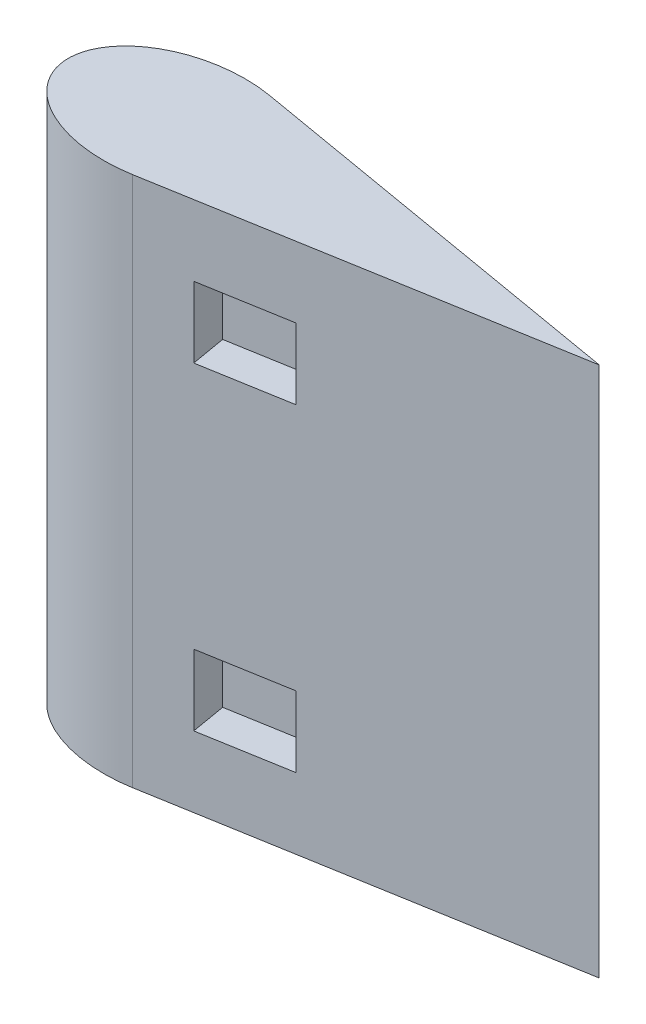
ISO-10303-21;
HEADER;
FILE_DESCRIPTION(('STEP AP214'),'2;1');
FILE_NAME('part.step','',(''),(''),'','','');
FILE_SCHEMA(('AUTOMOTIVE_DESIGN { 1 0 10303 214 1 1 1 1 }'));
ENDSEC;
DATA;
#1=APPLICATION_CONTEXT('core data for automotive mechanical design processes');
#2=APPLICATION_PROTOCOL_DEFINITION('international standard','automotive_design',2000,#1);
#3=PRODUCT_CONTEXT('',#1,'mechanical');
#4=PRODUCT('Part','Part','',(#3));
#5=PRODUCT_RELATED_PRODUCT_CATEGORY('part','',(#4));
#6=PRODUCT_DEFINITION_FORMATION('','',#4);
#7=PRODUCT_DEFINITION_CONTEXT('part definition',#1,'design');
#8=PRODUCT_DEFINITION('design','',#6,#7);
#9=PRODUCT_DEFINITION_SHAPE('','',#8);
#10=(LENGTH_UNIT() NAMED_UNIT(*) SI_UNIT(.MILLI.,.METRE.));
#11=(NAMED_UNIT(*) PLANE_ANGLE_UNIT() SI_UNIT($,.RADIAN.));
#12=(NAMED_UNIT(*) SI_UNIT($,.STERADIAN.) SOLID_ANGLE_UNIT());
#13=UNCERTAINTY_MEASURE_WITH_UNIT(LENGTH_MEASURE(1.E-05),#10,'distance_accuracy_value','');
#14=(GEOMETRIC_REPRESENTATION_CONTEXT(3) GLOBAL_UNCERTAINTY_ASSIGNED_CONTEXT((#13)) GLOBAL_UNIT_ASSIGNED_CONTEXT((#10,
#11,#12)) REPRESENTATION_CONTEXT('',''));
#15=CARTESIAN_POINT('',(0.,0.,0.));
#16=DIRECTION('',(0.,0.,1.));
#17=DIRECTION('',(1.,0.,0.));
#18=AXIS2_PLACEMENT_3D('',#15,#16,#17);
#19=CARTESIAN_POINT('',(150.000000000002,150.,1.21418486944109E-11));
#20=DIRECTION('',(-0.169637785935887,0.,-0.985506479726425));
#21=DIRECTION('',(-0.985506479726425,0.,0.169637785935887));
#22=AXIS2_PLACEMENT_3D('',#19,#20,#21);
#23=PLANE('',#22);
#24=DIRECTION('',(0.985506479726406,0.,-0.169637785935994));
#25=VECTOR('',#24,1.);
#26=CARTESIAN_POINT('',(76.9203577397009,110.,12.5793883298156));
#27=LINE('',#26,#25);
#28=CARTESIAN_POINT('',(52.2825971959239,110.,16.820349941994));
#29=VERTEX_POINT('',#28);
#30=CARTESIAN_POINT('',(76.9203577397009,110.,12.5793883298156));
#31=VERTEX_POINT('',#30);
#32=EDGE_CURVE('E152',#29,#31,#27,.T.);
#33=ORIENTED_EDGE('',*,*,#32,.F.);
#34=DIRECTION('',(0.,-1.,0.));
#35=VECTOR('',#34,1.);
#36=CARTESIAN_POINT('',(52.2825971958928,110.,16.820349941994));
#37=LINE('',#36,#35);
#38=CARTESIAN_POINT('',(52.2825971958928,130.,16.820349941994));
#39=VERTEX_POINT('',#38);
#40=EDGE_CURVE('E55',#39,#29,#37,.T.);
#41=ORIENTED_EDGE('',*,*,#40,.F.);
#42=DIRECTION('',(-0.985506479726406,0.,0.169637785935994));
#43=VECTOR('',#42,1.);
#44=CARTESIAN_POINT('',(52.2825971958928,130.,16.820349941994));
#45=LINE('',#44,#43);
#46=CARTESIAN_POINT('',(76.9203577397009,130.,12.5793883298156));
#47=VERTEX_POINT('',#46);
#48=EDGE_CURVE('E143',#47,#39,#45,.T.);
#49=ORIENTED_EDGE('',*,*,#48,.F.);
#50=DIRECTION('',(0.,1.,0.));
#51=VECTOR('',#50,1.);
#52=CARTESIAN_POINT('',(76.9203577397009,130.,12.5793883298156));
#53=LINE('',#52,#51);
#54=EDGE_CURVE('E146',#31,#47,#53,.T.);
#55=ORIENTED_EDGE('',*,*,#54,.F.);
#56=EDGE_LOOP('',(#33,#41,#49,#55));
#57=FACE_BOUND('',#56,.T.);
#58=DIRECTION('',(-0.985506479726406,0.,0.169637785935994));
#59=VECTOR('',#58,1.);
#60=CARTESIAN_POINT('',(76.920259189053,40.,12.5794052935942));
#61=LINE('',#60,#59);
#62=CARTESIAN_POINT('',(76.920259189053,40.,12.5794052936023));
#63=VERTEX_POINT('',#62);
#64=CARTESIAN_POINT('',(52.2825971958928,40.,16.820349941994));
#65=VERTEX_POINT('',#64);
#66=EDGE_CURVE('E178',#63,#65,#61,.T.);
#67=ORIENTED_EDGE('',*,*,#66,.F.);
#68=DIRECTION('',(0.,1.,0.));
#69=VECTOR('',#68,1.);
#70=CARTESIAN_POINT('',(76.920259189053,20.,12.5794052935942));
#71=LINE('',#70,#69);
#72=CARTESIAN_POINT('',(76.920259189053,20.,12.5794052935942));
#73=VERTEX_POINT('',#72);
#74=EDGE_CURVE('E63',#73,#63,#71,.T.);
#75=ORIENTED_EDGE('',*,*,#74,.F.);
#76=DIRECTION('',(0.985506479726406,0.,-0.169637785935994));
#77=VECTOR('',#76,1.);
#78=CARTESIAN_POINT('',(52.2825971958928,20.,16.820349941994));
#79=LINE('',#78,#77);
#80=CARTESIAN_POINT('',(52.2825971958928,20.,16.820349941994));
#81=VERTEX_POINT('',#80);
#82=EDGE_CURVE('E171',#81,#73,#79,.T.);
#83=ORIENTED_EDGE('',*,*,#82,.F.);
#84=DIRECTION('',(0.,-1.,0.));
#85=VECTOR('',#84,1.);
#86=CARTESIAN_POINT('',(52.2825971958928,40.,16.820349941994));
#87=LINE('',#86,#85);
#88=EDGE_CURVE('E174',#65,#81,#87,.T.);
#89=ORIENTED_EDGE('',*,*,#88,.F.);
#90=EDGE_LOOP('',(#67,#75,#83,#89));
#91=FACE_BOUND('',#90,.T.);
#92=DIRECTION('',(0.985506479726425,0.,-0.169637785935888));
#93=VECTOR('',#92,1.);
#94=CARTESIAN_POINT('',(150.000000000002,0.,1.21418486944109E-11));
#95=LINE('',#94,#93);
#96=CARTESIAN_POINT('',(37.4999999999957,0.,19.3649167310378));
#97=VERTEX_POINT('',#96);
#98=CARTESIAN_POINT('',(150.000000000002,0.,1.21418486944109E-11));
#99=VERTEX_POINT('',#98);
#100=EDGE_CURVE('E158',#97,#99,#95,.T.);
#101=ORIENTED_EDGE('',*,*,#100,.T.);
#102=DIRECTION('',(0.,-1.,0.));
#103=VECTOR('',#102,1.);
#104=CARTESIAN_POINT('',(150.000000000002,150.,1.21418486944109E-11));
#105=LINE('',#104,#103);
#106=CARTESIAN_POINT('',(150.000000000002,150.,1.21418486944109E-11));
#107=VERTEX_POINT('',#106);
#108=EDGE_CURVE('E11',#107,#99,#105,.T.);
#109=ORIENTED_EDGE('',*,*,#108,.F.);
#110=DIRECTION('',(0.985506479726425,0.,-0.169637785935888));
#111=VECTOR('',#110,1.);
#112=CARTESIAN_POINT('',(150.000000000002,150.,1.21418486944109E-11));
#113=LINE('',#112,#111);
#114=CARTESIAN_POINT('',(37.4999999999957,150.,19.3649167310378));
#115=VERTEX_POINT('',#114);
#116=EDGE_CURVE('E192',#115,#107,#113,.T.);
#117=ORIENTED_EDGE('',*,*,#116,.F.);
#118=DIRECTION('',(0.,-1.,0.));
#119=VECTOR('',#118,1.);
#120=CARTESIAN_POINT('',(37.4999999999957,150.,19.3649167310378));
#121=LINE('',#120,#119);
#122=EDGE_CURVE('E201',#115,#97,#121,.T.);
#123=ORIENTED_EDGE('',*,*,#122,.T.);
#124=EDGE_LOOP('',(#101,#109,#117,#123));
#125=FACE_BOUND('',#124,.T.);
#126=ADVANCED_FACE('F41',(#57,#91,#125),#23,.F.);
#127=CARTESIAN_POINT('',(150.000000000002,150.,1.21418486944109E-11));
#128=DIRECTION('',(-0.169637785936094,0.,0.985506479726389));
#129=DIRECTION('',(0.985506479726389,0.,0.169637785936094));
#130=AXIS2_PLACEMENT_3D('',#127,#128,#129);
#131=PLANE('',#130);
#132=DIRECTION('',(-0.985506479726389,0.,-0.169637785936094));
#133=VECTOR('',#132,1.);
#134=CARTESIAN_POINT('',(150.000000000002,0.,1.21418486944109E-11));
#135=LINE('',#134,#133);
#136=CARTESIAN_POINT('',(37.5000000000043,0.,-19.3649167310363));
#137=VERTEX_POINT('',#136);
#138=EDGE_CURVE('E219',#99,#137,#135,.T.);
#139=ORIENTED_EDGE('',*,*,#138,.T.);
#140=DIRECTION('',(0.,-1.,0.));
#141=VECTOR('',#140,1.);
#142=CARTESIAN_POINT('',(37.5000000000043,150.,-19.3649167310363));
#143=LINE('',#142,#141);
#144=CARTESIAN_POINT('',(37.5000000000043,150.,-19.3649167310363));
#145=VERTEX_POINT('',#144);
#146=EDGE_CURVE('E48',#145,#137,#143,.T.);
#147=ORIENTED_EDGE('',*,*,#146,.F.);
#148=DIRECTION('',(-0.985506479726389,0.,-0.169637785936094));
#149=VECTOR('',#148,1.);
#150=CARTESIAN_POINT('',(150.000000000002,150.,1.21418486944109E-11));
#151=LINE('',#150,#149);
#152=EDGE_CURVE('E195',#107,#145,#151,.T.);
#153=ORIENTED_EDGE('',*,*,#152,.F.);
#154=ORIENTED_EDGE('',*,*,#108,.T.);
#155=EDGE_LOOP('',(#139,#147,#153,#154));
#156=FACE_BOUND('',#155,.T.);
#157=ADVANCED_FACE('F208',(#156),#131,.F.);
#158=CARTESIAN_POINT('',(30.,150.,0.));
#159=DIRECTION('',(0.,1.,0.));
#160=DIRECTION('',(-1.,0.,0.));
#161=AXIS2_PLACEMENT_3D('',#158,#159,#160);
#162=ELLIPSE('',#161,30.,20.);
#163=DIRECTION('',(0.,-1.,0.));
#164=VECTOR('',#163,1.);
#165=SURFACE_OF_LINEAR_EXTRUSION('',#162,#164);
#166=CARTESIAN_POINT('',(30.,0.,0.));
#167=DIRECTION('',(0.,1.,0.));
#168=DIRECTION('',(-1.,0.,0.));
#169=AXIS2_PLACEMENT_3D('',#166,#167,#168);
#170=ELLIPSE('',#169,30.,20.);
#171=EDGE_CURVE('E196',#137,#97,#170,.T.);
#172=ORIENTED_EDGE('',*,*,#171,.T.);
#173=ORIENTED_EDGE('',*,*,#122,.F.);
#174=EDGE_CURVE('E198',#145,#115,#162,.T.);
#175=ORIENTED_EDGE('',*,*,#174,.F.);
#176=ORIENTED_EDGE('',*,*,#146,.T.);
#177=EDGE_LOOP('',(#172,#173,#175,#176));
#178=FACE_BOUND('',#177,.T.);
#179=ADVANCED_FACE('F204',(#178),#165,.F.);
#180=CARTESIAN_POINT('',(30.,150.,0.));
#181=DIRECTION('',(0.,1.,0.));
#182=DIRECTION('',(0.,0.,1.));
#183=AXIS2_PLACEMENT_3D('',#180,#181,#182);
#184=PLANE('',#183);
#185=ORIENTED_EDGE('',*,*,#116,.T.);
#186=ORIENTED_EDGE('',*,*,#152,.T.);
#187=ORIENTED_EDGE('',*,*,#174,.T.);
#188=EDGE_LOOP('',(#185,#186,#187));
#189=FACE_BOUND('',#188,.T.);
#190=ADVANCED_FACE('F207',(#189),#184,.T.);
#191=CARTESIAN_POINT('',(30.,0.,0.));
#192=DIRECTION('',(0.,1.,0.));
#193=DIRECTION('',(0.,0.,1.));
#194=AXIS2_PLACEMENT_3D('',#191,#192,#193);
#195=PLANE('',#194);
#196=ORIENTED_EDGE('',*,*,#100,.F.);
#197=ORIENTED_EDGE('',*,*,#171,.F.);
#198=ORIENTED_EDGE('',*,*,#138,.F.);
#199=EDGE_LOOP('',(#196,#197,#198));
#200=FACE_BOUND('',#199,.T.);
#201=ADVANCED_FACE('F210',(#200),#195,.F.);
#202=CARTESIAN_POINT('',(75.223881329693,20.,2.72434049633012));
#203=DIRECTION('',(0.985506479726406,0.,-0.169637785935994));
#204=DIRECTION('',(-0.169637785935994,0.,-0.985506479726406));
#205=AXIS2_PLACEMENT_3D('',#202,#203,#204);
#206=PLANE('',#205);
#207=ORIENTED_EDGE('',*,*,#74,.T.);
#208=DIRECTION('',(0.169637785935994,0.,0.985506479726406));
#209=VECTOR('',#208,1.);
#210=CARTESIAN_POINT('',(75.223881329693,40.,2.72434049633012));
#211=LINE('',#210,#209);
#212=CARTESIAN_POINT('',(75.223881329693,40.,2.72434049633012));
#213=VERTEX_POINT('',#212);
#214=EDGE_CURVE('E162',#213,#63,#211,.T.);
#215=ORIENTED_EDGE('',*,*,#214,.F.);
#216=DIRECTION('',(0.,1.,0.));
#217=VECTOR('',#216,1.);
#218=CARTESIAN_POINT('',(75.223881329693,20.,2.72434049633012));
#219=LINE('',#218,#217);
#220=CARTESIAN_POINT('',(75.223881329693,20.,2.72434049633012));
#221=VERTEX_POINT('',#220);
#222=EDGE_CURVE('E175',#221,#213,#219,.T.);
#223=ORIENTED_EDGE('',*,*,#222,.F.);
#224=DIRECTION('',(0.169637785935994,0.,0.985506479726406));
#225=VECTOR('',#224,1.);
#226=CARTESIAN_POINT('',(75.223881329693,20.,2.72434049633012));
#227=LINE('',#226,#225);
#228=EDGE_CURVE('E169',#221,#73,#227,.T.);
#229=ORIENTED_EDGE('',*,*,#228,.T.);
#230=EDGE_LOOP('',(#207,#215,#223,#229));
#231=FACE_BOUND('',#230,.T.);
#232=ADVANCED_FACE('F238',(#231),#206,.F.);
#233=CARTESIAN_POINT('',(50.5862193365329,20.,6.96528514472997));
#234=DIRECTION('',(0.,-1.,0.));
#235=DIRECTION('',(0.,0.,-1.));
#236=AXIS2_PLACEMENT_3D('',#233,#234,#235);
#237=PLANE('',#236);
#238=ORIENTED_EDGE('',*,*,#82,.T.);
#239=ORIENTED_EDGE('',*,*,#228,.F.);
#240=DIRECTION('',(0.985506479726406,0.,-0.169637785935994));
#241=VECTOR('',#240,1.);
#242=CARTESIAN_POINT('',(50.5862193365329,20.,6.96528514472997));
#243=LINE('',#242,#241);
#244=CARTESIAN_POINT('',(50.5862193365329,20.,6.96528514472997));
#245=VERTEX_POINT('',#244);
#246=EDGE_CURVE('E164',#245,#221,#243,.T.);
#247=ORIENTED_EDGE('',*,*,#246,.F.);
#248=DIRECTION('',(0.169637785935994,0.,0.985506479726406));
#249=VECTOR('',#248,1.);
#250=CARTESIAN_POINT('',(50.5862193365329,20.,6.96528514472997));
#251=LINE('',#250,#249);
#252=EDGE_CURVE('E167',#245,#81,#251,.T.);
#253=ORIENTED_EDGE('',*,*,#252,.T.);
#254=EDGE_LOOP('',(#238,#239,#247,#253));
#255=FACE_BOUND('',#254,.T.);
#256=ADVANCED_FACE('F245',(#255),#237,.F.);
#257=CARTESIAN_POINT('',(50.5862193365329,40.,6.96528514472997));
#258=DIRECTION('',(-0.985506479726406,0.,0.169637785935994));
#259=DIRECTION('',(0.169637785935994,0.,0.985506479726406));
#260=AXIS2_PLACEMENT_3D('',#257,#258,#259);
#261=PLANE('',#260);
#262=ORIENTED_EDGE('',*,*,#88,.T.);
#263=ORIENTED_EDGE('',*,*,#252,.F.);
#264=DIRECTION('',(0.,-1.,0.));
#265=VECTOR('',#264,1.);
#266=CARTESIAN_POINT('',(50.5862193365329,40.,6.96528514472997));
#267=LINE('',#266,#265);
#268=CARTESIAN_POINT('',(50.5862193365329,40.,6.96528514472997));
#269=VERTEX_POINT('',#268);
#270=EDGE_CURVE('E184',#269,#245,#267,.T.);
#271=ORIENTED_EDGE('',*,*,#270,.F.);
#272=DIRECTION('',(0.169637785935994,0.,0.985506479726406));
#273=VECTOR('',#272,1.);
#274=CARTESIAN_POINT('',(50.5862193365329,40.,6.96528514472997));
#275=LINE('',#274,#273);
#276=EDGE_CURVE('E165',#269,#65,#275,.T.);
#277=ORIENTED_EDGE('',*,*,#276,.T.);
#278=EDGE_LOOP('',(#262,#263,#271,#277));
#279=FACE_BOUND('',#278,.T.);
#280=ADVANCED_FACE('F248',(#279),#261,.F.);
#281=CARTESIAN_POINT('',(75.223881329693,40.,2.72434049633012));
#282=DIRECTION('',(0.,1.,0.));
#283=DIRECTION('',(0.,0.,1.));
#284=AXIS2_PLACEMENT_3D('',#281,#282,#283);
#285=PLANE('',#284);
#286=ORIENTED_EDGE('',*,*,#66,.T.);
#287=ORIENTED_EDGE('',*,*,#276,.F.);
#288=DIRECTION('',(-0.985506479726406,0.,0.169637785935994));
#289=VECTOR('',#288,1.);
#290=CARTESIAN_POINT('',(75.223881329693,40.,2.72434049633012));
#291=LINE('',#290,#289);
#292=EDGE_CURVE('E187',#213,#269,#291,.T.);
#293=ORIENTED_EDGE('',*,*,#292,.F.);
#294=ORIENTED_EDGE('',*,*,#214,.T.);
#295=EDGE_LOOP('',(#286,#287,#293,#294));
#296=FACE_BOUND('',#295,.T.);
#297=ADVANCED_FACE('F243',(#296),#285,.F.);
#298=CARTESIAN_POINT('',(2.62016890322937,0.,15.2218057896868));
#299=DIRECTION('',(0.169637785935994,0.,0.985506479726406));
#300=DIRECTION('',(0.985506479726406,0.,-0.169637785935994));
#301=AXIS2_PLACEMENT_3D('',#298,#299,#300);
#302=PLANE('',#301);
#303=ORIENTED_EDGE('',*,*,#222,.T.);
#304=ORIENTED_EDGE('',*,*,#292,.T.);
#305=ORIENTED_EDGE('',*,*,#270,.T.);
#306=ORIENTED_EDGE('',*,*,#246,.T.);
#307=EDGE_LOOP('',(#303,#304,#305,#306));
#308=FACE_BOUND('',#307,.T.);
#309=ADVANCED_FACE('F240',(#308),#302,.T.);
#310=CARTESIAN_POINT('',(50.5862193365328,110.,6.96528514472997));
#311=DIRECTION('',(-0.985506479726406,0.,0.169637785935994));
#312=DIRECTION('',(0.169637785935994,0.,0.985506479726406));
#313=AXIS2_PLACEMENT_3D('',#310,#311,#312);
#314=PLANE('',#313);
#315=ORIENTED_EDGE('',*,*,#40,.T.);
#316=DIRECTION('',(0.169637785935994,0.,0.985506479726406));
#317=VECTOR('',#316,1.);
#318=CARTESIAN_POINT('',(50.5862193365328,110.,6.96528514472997));
#319=LINE('',#318,#317);
#320=CARTESIAN_POINT('',(50.5862193365328,110.,6.96528514472997));
#321=VERTEX_POINT('',#320);
#322=EDGE_CURVE('E121',#321,#29,#319,.T.);
#323=ORIENTED_EDGE('',*,*,#322,.F.);
#324=DIRECTION('',(0.,-1.,0.));
#325=VECTOR('',#324,1.);
#326=CARTESIAN_POINT('',(50.5862193365328,110.,6.96528514472997));
#327=LINE('',#326,#325);
#328=CARTESIAN_POINT('',(50.5862193365328,130.,6.96528514472997));
#329=VERTEX_POINT('',#328);
#330=EDGE_CURVE('E125',#329,#321,#327,.T.);
#331=ORIENTED_EDGE('',*,*,#330,.F.);
#332=DIRECTION('',(0.169637785935994,0.,0.985506479726406));
#333=VECTOR('',#332,1.);
#334=CARTESIAN_POINT('',(50.5862193365328,130.,6.96528514472997));
#335=LINE('',#334,#333);
#336=EDGE_CURVE('E156',#329,#39,#335,.T.);
#337=ORIENTED_EDGE('',*,*,#336,.T.);
#338=EDGE_LOOP('',(#315,#323,#331,#337));
#339=FACE_BOUND('',#338,.T.);
#340=ADVANCED_FACE('F123',(#339),#314,.F.);
#341=CARTESIAN_POINT('',(50.5862193365328,130.,6.96528514472997));
#342=DIRECTION('',(0.,1.,0.));
#343=DIRECTION('',(0.,0.,1.));
#344=AXIS2_PLACEMENT_3D('',#341,#342,#343);
#345=PLANE('',#344);
#346=ORIENTED_EDGE('',*,*,#48,.T.);
#347=ORIENTED_EDGE('',*,*,#336,.F.);
#348=DIRECTION('',(-0.985506479727183,0.,0.16963778593148));
#349=VECTOR('',#348,1.);
#350=CARTESIAN_POINT('',(75.223881329693,130.,2.72434049633012));
#351=LINE('',#350,#349);
#352=CARTESIAN_POINT('',(75.223979880341,130.,2.72432353255152));
#353=VERTEX_POINT('',#352);
#354=EDGE_CURVE('E130',#353,#329,#351,.T.);
#355=ORIENTED_EDGE('',*,*,#354,.F.);
#356=DIRECTION('',(0.169637785935994,0.,0.985506479726406));
#357=VECTOR('',#356,1.);
#358=CARTESIAN_POINT('',(75.223979880341,130.,2.72432353255152));
#359=LINE('',#358,#357);
#360=EDGE_CURVE('E159',#353,#47,#359,.T.);
#361=ORIENTED_EDGE('',*,*,#360,.T.);
#362=EDGE_LOOP('',(#346,#347,#355,#361));
#363=FACE_BOUND('',#362,.T.);
#364=ADVANCED_FACE('F260',(#363),#345,.F.);
#365=CARTESIAN_POINT('',(75.223979880341,130.,2.72432353255152));
#366=DIRECTION('',(0.985506479726406,0.,-0.169637785935994));
#367=DIRECTION('',(-0.169637785935994,0.,-0.985506479726406));
#368=AXIS2_PLACEMENT_3D('',#365,#366,#367);
#369=PLANE('',#368);
#370=ORIENTED_EDGE('',*,*,#54,.T.);
#371=ORIENTED_EDGE('',*,*,#360,.F.);
#372=DIRECTION('',(0.,1.,0.));
#373=VECTOR('',#372,1.);
#374=CARTESIAN_POINT('',(75.223979880341,130.,2.72432353255152));
#375=LINE('',#374,#373);
#376=CARTESIAN_POINT('',(75.223979880341,110.,2.72432353255152));
#377=VERTEX_POINT('',#376);
#378=EDGE_CURVE('E138',#377,#353,#375,.T.);
#379=ORIENTED_EDGE('',*,*,#378,.F.);
#380=DIRECTION('',(0.169637785935994,0.,0.985506479726406));
#381=VECTOR('',#380,1.);
#382=CARTESIAN_POINT('',(75.223979880341,110.,2.72432353255152));
#383=LINE('',#382,#381);
#384=EDGE_CURVE('E129',#377,#31,#383,.T.);
#385=ORIENTED_EDGE('',*,*,#384,.T.);
#386=EDGE_LOOP('',(#370,#371,#379,#385));
#387=FACE_BOUND('',#386,.T.);
#388=ADVANCED_FACE('F263',(#387),#369,.F.);
#389=CARTESIAN_POINT('',(75.223979880341,110.,2.72432353255152));
#390=DIRECTION('',(0.,-1.,0.));
#391=DIRECTION('',(0.,0.,-1.));
#392=AXIS2_PLACEMENT_3D('',#389,#390,#391);
#393=PLANE('',#392);
#394=ORIENTED_EDGE('',*,*,#32,.T.);
#395=ORIENTED_EDGE('',*,*,#384,.F.);
#396=DIRECTION('',(0.985506479726406,0.,-0.169637785935994));
#397=VECTOR('',#396,1.);
#398=CARTESIAN_POINT('',(75.223979880341,110.,2.72432353255152));
#399=LINE('',#398,#397);
#400=EDGE_CURVE('E133',#321,#377,#399,.T.);
#401=ORIENTED_EDGE('',*,*,#400,.F.);
#402=ORIENTED_EDGE('',*,*,#322,.T.);
#403=EDGE_LOOP('',(#394,#395,#401,#402));
#404=FACE_BOUND('',#403,.T.);
#405=ADVANCED_FACE('F134',(#404),#393,.F.);
#406=CARTESIAN_POINT('',(2.62016890322937,0.,15.2218057896868));
#407=DIRECTION('',(-0.169637785935994,0.,-0.985506479726406));
#408=DIRECTION('',(-0.985506479726406,0.,0.169637785935994));
#409=AXIS2_PLACEMENT_3D('',#406,#407,#408);
#410=PLANE('',#409);
#411=ORIENTED_EDGE('',*,*,#330,.T.);
#412=ORIENTED_EDGE('',*,*,#400,.T.);
#413=ORIENTED_EDGE('',*,*,#378,.T.);
#414=ORIENTED_EDGE('',*,*,#354,.T.);
#415=EDGE_LOOP('',(#411,#412,#413,#414));
#416=FACE_BOUND('',#415,.T.);
#417=ADVANCED_FACE('F140',(#416),#410,.F.);
#418=CLOSED_SHELL('',(#126,#157,#179,#190,#201,#232,#256,#280,#297,#309,#340,#364,#388,#405,#417));
#419=MANIFOLD_SOLID_BREP('B2',#418);
#420=ADVANCED_BREP_SHAPE_REPRESENTATION('',(#18,#419),#14);
#421=SHAPE_DEFINITION_REPRESENTATION(#9,#420);
ENDSEC;
END-ISO-10303-21;
